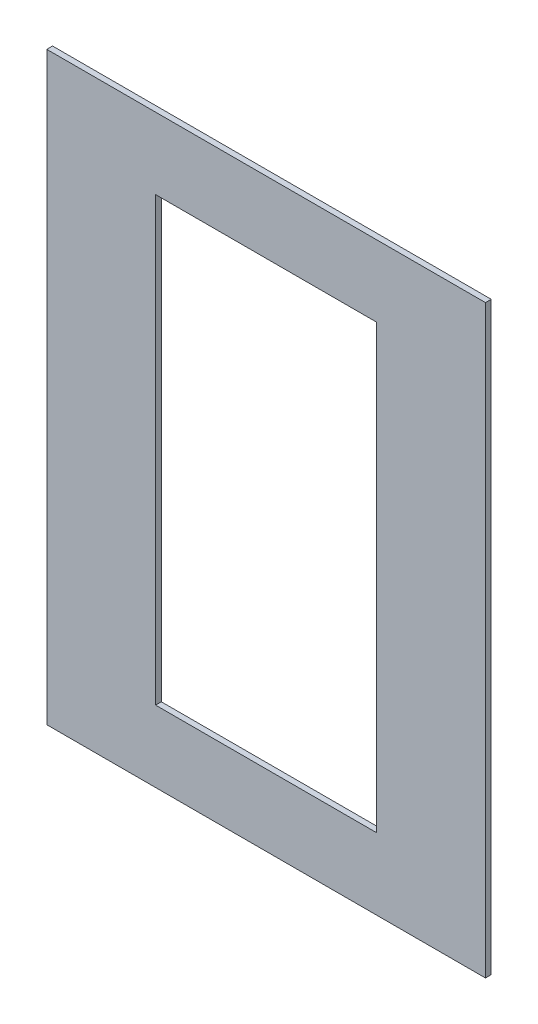
ISO-10303-21;
HEADER;
FILE_DESCRIPTION(('STEP AP214'),'2;1');
FILE_NAME('part.step','',(''),(''),'','','');
FILE_SCHEMA(('AUTOMOTIVE_DESIGN { 1 0 10303 214 1 1 1 1 }'));
ENDSEC;
DATA;
#1=APPLICATION_CONTEXT('core data for automotive mechanical design processes');
#2=APPLICATION_PROTOCOL_DEFINITION('international standard','automotive_design',2000,#1);
#3=PRODUCT_CONTEXT('',#1,'mechanical');
#4=PRODUCT('Part','Part','',(#3));
#5=PRODUCT_RELATED_PRODUCT_CATEGORY('part','',(#4));
#6=PRODUCT_DEFINITION_FORMATION('','',#4);
#7=PRODUCT_DEFINITION_CONTEXT('part definition',#1,'design');
#8=PRODUCT_DEFINITION('design','',#6,#7);
#9=PRODUCT_DEFINITION_SHAPE('','',#8);
#10=(LENGTH_UNIT() NAMED_UNIT(*) SI_UNIT(.MILLI.,.METRE.));
#11=(NAMED_UNIT(*) PLANE_ANGLE_UNIT() SI_UNIT($,.RADIAN.));
#12=(NAMED_UNIT(*) SI_UNIT($,.STERADIAN.) SOLID_ANGLE_UNIT());
#13=UNCERTAINTY_MEASURE_WITH_UNIT(LENGTH_MEASURE(1.E-05),#10,'distance_accuracy_value','');
#14=(GEOMETRIC_REPRESENTATION_CONTEXT(3) GLOBAL_UNCERTAINTY_ASSIGNED_CONTEXT((#13)) GLOBAL_UNIT_ASSIGNED_CONTEXT((#10,
#11,#12)) REPRESENTATION_CONTEXT('',''));
#15=CARTESIAN_POINT('',(0.,0.,0.));
#16=DIRECTION('',(0.,0.,1.));
#17=DIRECTION('',(1.,0.,0.));
#18=AXIS2_PLACEMENT_3D('',#15,#16,#17);
#19=CARTESIAN_POINT('',(0.,0.,5.));
#20=DIRECTION('',(1.,0.,0.));
#21=DIRECTION('',(0.,1.,0.));
#22=AXIS2_PLACEMENT_3D('',#19,#20,#21);
#23=PLANE('',#22);
#24=DIRECTION('',(0.,-1.,0.));
#25=VECTOR('',#24,1.);
#26=CARTESIAN_POINT('',(0.,0.,0.));
#27=LINE('',#26,#25);
#28=CARTESIAN_POINT('',(-1.11022302462516E-13,508.,0.));
#29=VERTEX_POINT('',#28);
#30=CARTESIAN_POINT('',(0.,0.,0.));
#31=VERTEX_POINT('',#30);
#32=EDGE_CURVE('E151',#29,#31,#27,.T.);
#33=ORIENTED_EDGE('',*,*,#32,.T.);
#34=DIRECTION('',(0.,0.,-1.));
#35=VECTOR('',#34,1.);
#36=CARTESIAN_POINT('',(0.,0.,5.));
#37=LINE('',#36,#35);
#38=CARTESIAN_POINT('',(0.,0.,5.));
#39=VERTEX_POINT('',#38);
#40=EDGE_CURVE('E11',#39,#31,#37,.T.);
#41=ORIENTED_EDGE('',*,*,#40,.F.);
#42=DIRECTION('',(0.,-1.,0.));
#43=VECTOR('',#42,1.);
#44=CARTESIAN_POINT('',(0.,0.,5.));
#45=LINE('',#44,#43);
#46=CARTESIAN_POINT('',(-1.11022302462516E-13,508.,5.));
#47=VERTEX_POINT('',#46);
#48=EDGE_CURVE('E157',#47,#39,#45,.T.);
#49=ORIENTED_EDGE('',*,*,#48,.F.);
#50=DIRECTION('',(0.,0.,-1.));
#51=VECTOR('',#50,1.);
#52=CARTESIAN_POINT('',(-1.11022302462516E-13,508.,5.));
#53=LINE('',#52,#51);
#54=EDGE_CURVE('E171',#47,#29,#53,.T.);
#55=ORIENTED_EDGE('',*,*,#54,.T.);
#56=EDGE_LOOP('',(#33,#41,#49,#55));
#57=FACE_BOUND('',#56,.T.);
#58=ADVANCED_FACE('F43',(#57),#23,.F.);
#59=CARTESIAN_POINT('',(0.,0.,5.));
#60=DIRECTION('',(0.,1.,0.));
#61=DIRECTION('',(0.,0.,1.));
#62=AXIS2_PLACEMENT_3D('',#59,#60,#61);
#63=PLANE('',#62);
#64=DIRECTION('',(1.,0.,0.));
#65=VECTOR('',#64,1.);
#66=CARTESIAN_POINT('',(0.,0.,0.));
#67=LINE('',#66,#65);
#68=CARTESIAN_POINT('',(381.,0.,0.));
#69=VERTEX_POINT('',#68);
#70=EDGE_CURVE('E175',#31,#69,#67,.T.);
#71=ORIENTED_EDGE('',*,*,#70,.T.);
#72=DIRECTION('',(0.,0.,-1.));
#73=VECTOR('',#72,1.);
#74=CARTESIAN_POINT('',(381.,0.,5.));
#75=LINE('',#74,#73);
#76=CARTESIAN_POINT('',(381.,0.,5.));
#77=VERTEX_POINT('',#76);
#78=EDGE_CURVE('E51',#77,#69,#75,.T.);
#79=ORIENTED_EDGE('',*,*,#78,.F.);
#80=DIRECTION('',(1.,0.,0.));
#81=VECTOR('',#80,1.);
#82=CARTESIAN_POINT('',(0.,0.,5.));
#83=LINE('',#82,#81);
#84=EDGE_CURVE('E161',#39,#77,#83,.T.);
#85=ORIENTED_EDGE('',*,*,#84,.F.);
#86=ORIENTED_EDGE('',*,*,#40,.T.);
#87=EDGE_LOOP('',(#71,#79,#85,#86));
#88=FACE_BOUND('',#87,.T.);
#89=ADVANCED_FACE('F209',(#88),#63,.F.);
#90=CARTESIAN_POINT('',(381.,0.,5.));
#91=DIRECTION('',(-1.,0.,0.));
#92=DIRECTION('',(0.,-1.,0.));
#93=AXIS2_PLACEMENT_3D('',#90,#91,#92);
#94=PLANE('',#93);
#95=DIRECTION('',(0.,1.,0.));
#96=VECTOR('',#95,1.);
#97=CARTESIAN_POINT('',(381.,0.,0.));
#98=LINE('',#97,#96);
#99=CARTESIAN_POINT('',(381.,508.,0.));
#100=VERTEX_POINT('',#99);
#101=EDGE_CURVE('E178',#69,#100,#98,.T.);
#102=ORIENTED_EDGE('',*,*,#101,.T.);
#103=DIRECTION('',(0.,0.,-1.));
#104=VECTOR('',#103,1.);
#105=CARTESIAN_POINT('',(381.,508.,5.));
#106=LINE('',#105,#104);
#107=CARTESIAN_POINT('',(381.,508.,5.));
#108=VERTEX_POINT('',#107);
#109=EDGE_CURVE('E186',#108,#100,#106,.T.);
#110=ORIENTED_EDGE('',*,*,#109,.F.);
#111=DIRECTION('',(0.,1.,0.));
#112=VECTOR('',#111,1.);
#113=CARTESIAN_POINT('',(381.,0.,5.));
#114=LINE('',#113,#112);
#115=EDGE_CURVE('E165',#77,#108,#114,.T.);
#116=ORIENTED_EDGE('',*,*,#115,.F.);
#117=ORIENTED_EDGE('',*,*,#78,.T.);
#118=EDGE_LOOP('',(#102,#110,#116,#117));
#119=FACE_BOUND('',#118,.T.);
#120=ADVANCED_FACE('F195',(#119),#94,.F.);
#121=CARTESIAN_POINT('',(-1.11022302462516E-13,508.,5.));
#122=DIRECTION('',(0.,-1.,0.));
#123=DIRECTION('',(0.,0.,-1.));
#124=AXIS2_PLACEMENT_3D('',#121,#122,#123);
#125=PLANE('',#124);
#126=DIRECTION('',(-1.,0.,0.));
#127=VECTOR('',#126,1.);
#128=CARTESIAN_POINT('',(-1.11022302462516E-13,508.,0.));
#129=LINE('',#128,#127);
#130=EDGE_CURVE('E162',#100,#29,#129,.T.);
#131=ORIENTED_EDGE('',*,*,#130,.T.);
#132=ORIENTED_EDGE('',*,*,#54,.F.);
#133=DIRECTION('',(-1.,0.,0.));
#134=VECTOR('',#133,1.);
#135=CARTESIAN_POINT('',(-1.11022302462516E-13,508.,5.));
#136=LINE('',#135,#134);
#137=EDGE_CURVE('E168',#108,#47,#136,.T.);
#138=ORIENTED_EDGE('',*,*,#137,.F.);
#139=ORIENTED_EDGE('',*,*,#109,.T.);
#140=EDGE_LOOP('',(#131,#132,#138,#139));
#141=FACE_BOUND('',#140,.T.);
#142=ADVANCED_FACE('F202',(#141),#125,.F.);
#143=CARTESIAN_POINT('',(0.,0.,5.));
#144=DIRECTION('',(0.,0.,-1.));
#145=DIRECTION('',(-1.,0.,0.));
#146=AXIS2_PLACEMENT_3D('',#143,#144,#145);
#147=PLANE('',#146);
#148=DIRECTION('',(1.,0.,0.));
#149=VECTOR('',#148,1.);
#150=CARTESIAN_POINT('',(94.4999999999999,62.0000000000001,5.));
#151=LINE('',#150,#149);
#152=CARTESIAN_POINT('',(94.4999999999999,62.0000000000001,5.));
#153=VERTEX_POINT('',#152);
#154=CARTESIAN_POINT('',(286.5,62.0000000000001,5.));
#155=VERTEX_POINT('',#154);
#156=EDGE_CURVE('E142',#153,#155,#151,.T.);
#157=ORIENTED_EDGE('',*,*,#156,.F.);
#158=DIRECTION('',(0.,-1.,0.));
#159=VECTOR('',#158,1.);
#160=CARTESIAN_POINT('',(94.4999999999999,446.,5.));
#161=LINE('',#160,#159);
#162=CARTESIAN_POINT('',(94.4999999999999,446.,5.));
#163=VERTEX_POINT('',#162);
#164=EDGE_CURVE('E58',#163,#153,#161,.T.);
#165=ORIENTED_EDGE('',*,*,#164,.F.);
#166=DIRECTION('',(-1.,0.,0.));
#167=VECTOR('',#166,1.);
#168=CARTESIAN_POINT('',(94.4999999999999,446.,5.));
#169=LINE('',#168,#167);
#170=CARTESIAN_POINT('',(286.5,446.,5.));
#171=VERTEX_POINT('',#170);
#172=EDGE_CURVE('E129',#171,#163,#169,.T.);
#173=ORIENTED_EDGE('',*,*,#172,.F.);
#174=DIRECTION('',(0.,1.,0.));
#175=VECTOR('',#174,1.);
#176=CARTESIAN_POINT('',(286.5,446.,5.));
#177=LINE('',#176,#175);
#178=EDGE_CURVE('E133',#155,#171,#177,.T.);
#179=ORIENTED_EDGE('',*,*,#178,.F.);
#180=EDGE_LOOP('',(#157,#165,#173,#179));
#181=FACE_BOUND('',#180,.T.);
#182=ORIENTED_EDGE('',*,*,#48,.T.);
#183=ORIENTED_EDGE('',*,*,#84,.T.);
#184=ORIENTED_EDGE('',*,*,#115,.T.);
#185=ORIENTED_EDGE('',*,*,#137,.T.);
#186=EDGE_LOOP('',(#182,#183,#184,#185));
#187=FACE_BOUND('',#186,.T.);
#188=ADVANCED_FACE('F208',(#181,#187),#147,.F.);
#189=CARTESIAN_POINT('',(0.,0.,0.));
#190=DIRECTION('',(0.,0.,-1.));
#191=DIRECTION('',(-1.,0.,0.));
#192=AXIS2_PLACEMENT_3D('',#189,#190,#191);
#193=PLANE('',#192);
#194=DIRECTION('',(0.,-1.,0.));
#195=VECTOR('',#194,1.);
#196=CARTESIAN_POINT('',(94.4999999999999,446.,0.));
#197=LINE('',#196,#195);
#198=CARTESIAN_POINT('',(94.4999999999999,446.,0.));
#199=VERTEX_POINT('',#198);
#200=CARTESIAN_POINT('',(94.4999999999999,62.0000000000001,0.));
#201=VERTEX_POINT('',#200);
#202=EDGE_CURVE('E110',#199,#201,#197,.T.);
#203=ORIENTED_EDGE('',*,*,#202,.T.);
#204=DIRECTION('',(1.,0.,0.));
#205=VECTOR('',#204,1.);
#206=CARTESIAN_POINT('',(94.4999999999999,62.0000000000001,0.));
#207=LINE('',#206,#205);
#208=CARTESIAN_POINT('',(286.5,62.0000000000001,0.));
#209=VERTEX_POINT('',#208);
#210=EDGE_CURVE('E120',#201,#209,#207,.T.);
#211=ORIENTED_EDGE('',*,*,#210,.T.);
#212=DIRECTION('',(0.,1.,0.));
#213=VECTOR('',#212,1.);
#214=CARTESIAN_POINT('',(286.5,446.,0.));
#215=LINE('',#214,#213);
#216=CARTESIAN_POINT('',(286.5,446.,0.));
#217=VERTEX_POINT('',#216);
#218=EDGE_CURVE('E66',#209,#217,#215,.T.);
#219=ORIENTED_EDGE('',*,*,#218,.T.);
#220=DIRECTION('',(-1.,0.,0.));
#221=VECTOR('',#220,1.);
#222=CARTESIAN_POINT('',(94.4999999999999,446.,0.));
#223=LINE('',#222,#221);
#224=EDGE_CURVE('E117',#217,#199,#223,.T.);
#225=ORIENTED_EDGE('',*,*,#224,.T.);
#226=EDGE_LOOP('',(#203,#211,#219,#225));
#227=FACE_BOUND('',#226,.T.);
#228=ORIENTED_EDGE('',*,*,#32,.F.);
#229=ORIENTED_EDGE('',*,*,#130,.F.);
#230=ORIENTED_EDGE('',*,*,#101,.F.);
#231=ORIENTED_EDGE('',*,*,#70,.F.);
#232=EDGE_LOOP('',(#228,#229,#230,#231));
#233=FACE_BOUND('',#232,.T.);
#234=ADVANCED_FACE('F125',(#227,#233),#193,.T.);
#235=CARTESIAN_POINT('',(94.4999999999999,446.,0.));
#236=DIRECTION('',(-1.,0.,0.));
#237=DIRECTION('',(0.,-1.,0.));
#238=AXIS2_PLACEMENT_3D('',#235,#236,#237);
#239=PLANE('',#238);
#240=ORIENTED_EDGE('',*,*,#164,.T.);
#241=DIRECTION('',(0.,0.,1.));
#242=VECTOR('',#241,1.);
#243=CARTESIAN_POINT('',(94.4999999999999,62.0000000000001,0.));
#244=LINE('',#243,#242);
#245=EDGE_CURVE('E106',#201,#153,#244,.T.);
#246=ORIENTED_EDGE('',*,*,#245,.F.);
#247=ORIENTED_EDGE('',*,*,#202,.F.);
#248=DIRECTION('',(0.,0.,1.));
#249=VECTOR('',#248,1.);
#250=CARTESIAN_POINT('',(94.4999999999999,446.,0.));
#251=LINE('',#250,#249);
#252=EDGE_CURVE('E148',#199,#163,#251,.T.);
#253=ORIENTED_EDGE('',*,*,#252,.T.);
#254=EDGE_LOOP('',(#240,#246,#247,#253));
#255=FACE_BOUND('',#254,.T.);
#256=ADVANCED_FACE('F108',(#255),#239,.F.);
#257=CARTESIAN_POINT('',(94.4999999999999,446.,0.));
#258=DIRECTION('',(0.,1.,0.));
#259=DIRECTION('',(-1.,0.,0.));
#260=AXIS2_PLACEMENT_3D('',#257,#258,#259);
#261=PLANE('',#260);
#262=ORIENTED_EDGE('',*,*,#172,.T.);
#263=ORIENTED_EDGE('',*,*,#252,.F.);
#264=ORIENTED_EDGE('',*,*,#224,.F.);
#265=DIRECTION('',(0.,0.,1.));
#266=VECTOR('',#265,1.);
#267=CARTESIAN_POINT('',(286.5,446.,0.));
#268=LINE('',#267,#266);
#269=EDGE_CURVE('E152',#217,#171,#268,.T.);
#270=ORIENTED_EDGE('',*,*,#269,.T.);
#271=EDGE_LOOP('',(#262,#263,#264,#270));
#272=FACE_BOUND('',#271,.T.);
#273=ADVANCED_FACE('F226',(#272),#261,.F.);
#274=CARTESIAN_POINT('',(286.5,446.,0.));
#275=DIRECTION('',(1.,0.,0.));
#276=DIRECTION('',(0.,1.,0.));
#277=AXIS2_PLACEMENT_3D('',#274,#275,#276);
#278=PLANE('',#277);
#279=ORIENTED_EDGE('',*,*,#178,.T.);
#280=ORIENTED_EDGE('',*,*,#269,.F.);
#281=ORIENTED_EDGE('',*,*,#218,.F.);
#282=DIRECTION('',(0.,0.,1.));
#283=VECTOR('',#282,1.);
#284=CARTESIAN_POINT('',(286.5,62.0000000000001,0.));
#285=LINE('',#284,#283);
#286=EDGE_CURVE('E116',#209,#155,#285,.T.);
#287=ORIENTED_EDGE('',*,*,#286,.T.);
#288=EDGE_LOOP('',(#279,#280,#281,#287));
#289=FACE_BOUND('',#288,.T.);
#290=ADVANCED_FACE('F229',(#289),#278,.F.);
#291=CARTESIAN_POINT('',(94.4999999999999,62.0000000000001,0.));
#292=DIRECTION('',(0.,-1.,0.));
#293=DIRECTION('',(0.,0.,-1.));
#294=AXIS2_PLACEMENT_3D('',#291,#292,#293);
#295=PLANE('',#294);
#296=ORIENTED_EDGE('',*,*,#156,.T.);
#297=ORIENTED_EDGE('',*,*,#286,.F.);
#298=ORIENTED_EDGE('',*,*,#210,.F.);
#299=ORIENTED_EDGE('',*,*,#245,.T.);
#300=EDGE_LOOP('',(#296,#297,#298,#299));
#301=FACE_BOUND('',#300,.T.);
#302=ADVANCED_FACE('F121',(#301),#295,.F.);
#303=CLOSED_SHELL('',(#58,#89,#120,#142,#188,#234,#256,#273,#290,#302));
#304=MANIFOLD_SOLID_BREP('B2',#303);
#305=ADVANCED_BREP_SHAPE_REPRESENTATION('',(#18,#304),#14);
#306=SHAPE_DEFINITION_REPRESENTATION(#9,#305);
ENDSEC;
END-ISO-10303-21;
